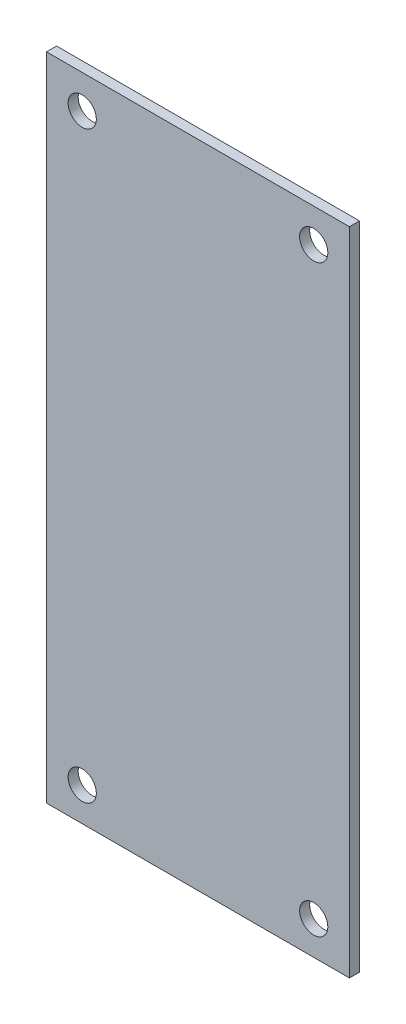
ISO-10303-21;
HEADER;
FILE_DESCRIPTION(('STEP AP214'),'2;1');
FILE_NAME('part.step','',(''),(''),'','','');
FILE_SCHEMA(('AUTOMOTIVE_DESIGN { 1 0 10303 214 1 1 1 1 }'));
ENDSEC;
DATA;
#1=APPLICATION_CONTEXT('core data for automotive mechanical design processes');
#2=APPLICATION_PROTOCOL_DEFINITION('international standard','automotive_design',2000,#1);
#3=PRODUCT_CONTEXT('',#1,'mechanical');
#4=PRODUCT('Part','Part','',(#3));
#5=PRODUCT_RELATED_PRODUCT_CATEGORY('part','',(#4));
#6=PRODUCT_DEFINITION_FORMATION('','',#4);
#7=PRODUCT_DEFINITION_CONTEXT('part definition',#1,'design');
#8=PRODUCT_DEFINITION('design','',#6,#7);
#9=PRODUCT_DEFINITION_SHAPE('','',#8);
#10=(LENGTH_UNIT() NAMED_UNIT(*) SI_UNIT(.MILLI.,.METRE.));
#11=(NAMED_UNIT(*) PLANE_ANGLE_UNIT() SI_UNIT($,.RADIAN.));
#12=(NAMED_UNIT(*) SI_UNIT($,.STERADIAN.) SOLID_ANGLE_UNIT());
#13=UNCERTAINTY_MEASURE_WITH_UNIT(LENGTH_MEASURE(1.E-05),#10,'distance_accuracy_value','');
#14=(GEOMETRIC_REPRESENTATION_CONTEXT(3) GLOBAL_UNCERTAINTY_ASSIGNED_CONTEXT((#13)) GLOBAL_UNIT_ASSIGNED_CONTEXT((#10,
#11,#12)) REPRESENTATION_CONTEXT('',''));
#15=CARTESIAN_POINT('',(0.,0.,0.));
#16=DIRECTION('',(0.,0.,1.));
#17=DIRECTION('',(1.,0.,0.));
#18=AXIS2_PLACEMENT_3D('',#15,#16,#17);
#19=CARTESIAN_POINT('',(0.,0.,1.));
#20=DIRECTION('',(0.,0.,1.));
#21=DIRECTION('',(1.,0.,0.));
#22=AXIS2_PLACEMENT_3D('',#19,#20,#21);
#23=PLANE('',#22);
#24=CARTESIAN_POINT('',(11.5,29.,1.));
#25=DIRECTION('',(0.,0.,1.));
#26=DIRECTION('',(-1.,0.,0.));
#27=AXIS2_PLACEMENT_3D('',#24,#25,#26);
#28=CIRCLE('',#27,1.4);
#29=CARTESIAN_POINT('',(10.1,29.,1.));
#30=VERTEX_POINT('',#29);
#31=EDGE_CURVE('E142',#30,#30,#28,.T.);
#32=ORIENTED_EDGE('',*,*,#31,.F.);
#33=EDGE_LOOP('',(#32));
#34=FACE_BOUND('',#33,.T.);
#35=CARTESIAN_POINT('',(-11.5,-29.,1.));
#36=DIRECTION('',(0.,0.,1.));
#37=DIRECTION('',(1.,0.,0.));
#38=AXIS2_PLACEMENT_3D('',#35,#36,#37);
#39=CIRCLE('',#38,1.4);
#40=CARTESIAN_POINT('',(-10.1,-29.,1.));
#41=VERTEX_POINT('',#40);
#42=EDGE_CURVE('E112',#41,#41,#39,.T.);
#43=ORIENTED_EDGE('',*,*,#42,.F.);
#44=EDGE_LOOP('',(#43));
#45=FACE_BOUND('',#44,.T.);
#46=DIRECTION('',(0.,-1.,0.));
#47=VECTOR('',#46,1.);
#48=CARTESIAN_POINT('',(-15.05,-32.3215,1.));
#49=LINE('',#48,#47);
#50=CARTESIAN_POINT('',(-15.05,32.3215,1.));
#51=VERTEX_POINT('',#50);
#52=CARTESIAN_POINT('',(-15.05,-32.3215,1.));
#53=VERTEX_POINT('',#52);
#54=EDGE_CURVE('E92',#51,#53,#49,.T.);
#55=ORIENTED_EDGE('',*,*,#54,.T.);
#56=DIRECTION('',(1.,0.,0.));
#57=VECTOR('',#56,1.);
#58=CARTESIAN_POINT('',(15.05,-32.3215,1.));
#59=LINE('',#58,#57);
#60=CARTESIAN_POINT('',(15.05,-32.3215,1.));
#61=VERTEX_POINT('',#60);
#62=EDGE_CURVE('E87',#53,#61,#59,.T.);
#63=ORIENTED_EDGE('',*,*,#62,.T.);
#64=DIRECTION('',(0.,1.,0.));
#65=VECTOR('',#64,1.);
#66=CARTESIAN_POINT('',(15.05,-32.3215,1.));
#67=LINE('',#66,#65);
#68=CARTESIAN_POINT('',(15.05,32.3215,1.));
#69=VERTEX_POINT('',#68);
#70=EDGE_CURVE('E90',#61,#69,#67,.T.);
#71=ORIENTED_EDGE('',*,*,#70,.T.);
#72=DIRECTION('',(-1.,0.,0.));
#73=VECTOR('',#72,1.);
#74=CARTESIAN_POINT('',(15.05,32.3215,1.));
#75=LINE('',#74,#73);
#76=EDGE_CURVE('E57',#69,#51,#75,.T.);
#77=ORIENTED_EDGE('',*,*,#76,.T.);
#78=EDGE_LOOP('',(#55,#63,#71,#77));
#79=FACE_BOUND('',#78,.T.);
#80=CARTESIAN_POINT('',(11.5,-29.,1.));
#81=DIRECTION('',(0.,0.,1.));
#82=DIRECTION('',(1.,0.,0.));
#83=AXIS2_PLACEMENT_3D('',#80,#81,#82);
#84=CIRCLE('',#83,1.4);
#85=CARTESIAN_POINT('',(12.9,-29.,1.));
#86=VERTEX_POINT('',#85);
#87=EDGE_CURVE('E134',#86,#86,#84,.T.);
#88=ORIENTED_EDGE('',*,*,#87,.F.);
#89=EDGE_LOOP('',(#88));
#90=FACE_BOUND('',#89,.T.);
#91=CARTESIAN_POINT('',(-11.5,29.,1.));
#92=DIRECTION('',(0.,0.,1.));
#93=DIRECTION('',(-1.,0.,0.));
#94=AXIS2_PLACEMENT_3D('',#91,#92,#93);
#95=CIRCLE('',#94,1.4);
#96=CARTESIAN_POINT('',(-12.9,29.,1.));
#97=VERTEX_POINT('',#96);
#98=EDGE_CURVE('E150',#97,#97,#95,.T.);
#99=ORIENTED_EDGE('',*,*,#98,.F.);
#100=EDGE_LOOP('',(#99));
#101=FACE_BOUND('',#100,.T.);
#102=ADVANCED_FACE('F39',(#34,#45,#79,#90,#101),#23,.T.);
#103=CARTESIAN_POINT('',(0.,0.,0.));
#104=DIRECTION('',(0.,0.,1.));
#105=DIRECTION('',(1.,0.,0.));
#106=AXIS2_PLACEMENT_3D('',#103,#104,#105);
#107=PLANE('',#106);
#108=DIRECTION('',(0.,-1.,0.));
#109=VECTOR('',#108,1.);
#110=CARTESIAN_POINT('',(-15.05,-32.3215,0.));
#111=LINE('',#110,#109);
#112=CARTESIAN_POINT('',(-15.05,32.3215,0.));
#113=VERTEX_POINT('',#112);
#114=CARTESIAN_POINT('',(-15.05,-32.3215,0.));
#115=VERTEX_POINT('',#114);
#116=EDGE_CURVE('E108',#113,#115,#111,.T.);
#117=ORIENTED_EDGE('',*,*,#116,.F.);
#118=DIRECTION('',(-1.,0.,0.));
#119=VECTOR('',#118,1.);
#120=CARTESIAN_POINT('',(15.05,32.3215,0.));
#121=LINE('',#120,#119);
#122=CARTESIAN_POINT('',(15.05,32.3215,0.));
#123=VERTEX_POINT('',#122);
#124=EDGE_CURVE('E80',#123,#113,#121,.T.);
#125=ORIENTED_EDGE('',*,*,#124,.F.);
#126=DIRECTION('',(0.,1.,0.));
#127=VECTOR('',#126,1.);
#128=CARTESIAN_POINT('',(15.05,-32.3215,0.));
#129=LINE('',#128,#127);
#130=CARTESIAN_POINT('',(15.05,-32.3215,0.));
#131=VERTEX_POINT('',#130);
#132=EDGE_CURVE('E74',#131,#123,#129,.T.);
#133=ORIENTED_EDGE('',*,*,#132,.F.);
#134=DIRECTION('',(1.,0.,0.));
#135=VECTOR('',#134,1.);
#136=CARTESIAN_POINT('',(15.05,-32.3215,0.));
#137=LINE('',#136,#135);
#138=EDGE_CURVE('E97',#115,#131,#137,.T.);
#139=ORIENTED_EDGE('',*,*,#138,.F.);
#140=EDGE_LOOP('',(#117,#125,#133,#139));
#141=FACE_BOUND('',#140,.T.);
#142=CARTESIAN_POINT('',(-11.5,-29.,0.));
#143=DIRECTION('',(0.,0.,1.));
#144=DIRECTION('',(1.,0.,0.));
#145=AXIS2_PLACEMENT_3D('',#142,#143,#144);
#146=CIRCLE('',#145,1.4);
#147=CARTESIAN_POINT('',(-10.1,-29.,0.));
#148=VERTEX_POINT('',#147);
#149=EDGE_CURVE('E130',#148,#148,#146,.T.);
#150=ORIENTED_EDGE('',*,*,#149,.T.);
#151=EDGE_LOOP('',(#150));
#152=FACE_BOUND('',#151,.T.);
#153=CARTESIAN_POINT('',(11.5,-29.,0.));
#154=DIRECTION('',(0.,0.,1.));
#155=DIRECTION('',(1.,0.,0.));
#156=AXIS2_PLACEMENT_3D('',#153,#154,#155);
#157=CIRCLE('',#156,1.4);
#158=CARTESIAN_POINT('',(12.9,-29.,0.));
#159=VERTEX_POINT('',#158);
#160=EDGE_CURVE('E138',#159,#159,#157,.T.);
#161=ORIENTED_EDGE('',*,*,#160,.T.);
#162=EDGE_LOOP('',(#161));
#163=FACE_BOUND('',#162,.T.);
#164=CARTESIAN_POINT('',(11.5,29.,0.));
#165=DIRECTION('',(0.,0.,1.));
#166=DIRECTION('',(-1.,0.,0.));
#167=AXIS2_PLACEMENT_3D('',#164,#165,#166);
#168=CIRCLE('',#167,1.4);
#169=CARTESIAN_POINT('',(10.1,29.,0.));
#170=VERTEX_POINT('',#169);
#171=EDGE_CURVE('E146',#170,#170,#168,.T.);
#172=ORIENTED_EDGE('',*,*,#171,.T.);
#173=EDGE_LOOP('',(#172));
#174=FACE_BOUND('',#173,.T.);
#175=CARTESIAN_POINT('',(-11.5,29.,0.));
#176=DIRECTION('',(0.,0.,1.));
#177=DIRECTION('',(-1.,0.,0.));
#178=AXIS2_PLACEMENT_3D('',#175,#176,#177);
#179=CIRCLE('',#178,1.4);
#180=CARTESIAN_POINT('',(-12.9,29.,0.));
#181=VERTEX_POINT('',#180);
#182=EDGE_CURVE('E154',#181,#181,#179,.T.);
#183=ORIENTED_EDGE('',*,*,#182,.T.);
#184=EDGE_LOOP('',(#183));
#185=FACE_BOUND('',#184,.T.);
#186=ADVANCED_FACE('F125',(#141,#152,#163,#174,#185),#107,.F.);
#187=CARTESIAN_POINT('',(-15.05,-32.3215,1.));
#188=DIRECTION('',(1.,0.,0.));
#189=DIRECTION('',(0.,0.,-1.));
#190=AXIS2_PLACEMENT_3D('',#187,#188,#189);
#191=PLANE('',#190);
#192=ORIENTED_EDGE('',*,*,#116,.T.);
#193=DIRECTION('',(0.,0.,-1.));
#194=VECTOR('',#193,1.);
#195=CARTESIAN_POINT('',(-15.05,-32.3215,1.));
#196=LINE('',#195,#194);
#197=EDGE_CURVE('E11',#53,#115,#196,.T.);
#198=ORIENTED_EDGE('',*,*,#197,.F.);
#199=ORIENTED_EDGE('',*,*,#54,.F.);
#200=DIRECTION('',(0.,0.,-1.));
#201=VECTOR('',#200,1.);
#202=CARTESIAN_POINT('',(-15.05,32.3215,1.));
#203=LINE('',#202,#201);
#204=EDGE_CURVE('E104',#51,#113,#203,.T.);
#205=ORIENTED_EDGE('',*,*,#204,.T.);
#206=EDGE_LOOP('',(#192,#198,#199,#205));
#207=FACE_BOUND('',#206,.T.);
#208=ADVANCED_FACE('F41',(#207),#191,.F.);
#209=CARTESIAN_POINT('',(15.05,-32.3215,1.));
#210=DIRECTION('',(0.,1.,0.));
#211=DIRECTION('',(0.,0.,1.));
#212=AXIS2_PLACEMENT_3D('',#209,#210,#211);
#213=PLANE('',#212);
#214=ORIENTED_EDGE('',*,*,#138,.T.);
#215=DIRECTION('',(0.,0.,-1.));
#216=VECTOR('',#215,1.);
#217=CARTESIAN_POINT('',(15.05,-32.3215,1.));
#218=LINE('',#217,#216);
#219=EDGE_CURVE('E49',#61,#131,#218,.T.);
#220=ORIENTED_EDGE('',*,*,#219,.F.);
#221=ORIENTED_EDGE('',*,*,#62,.F.);
#222=ORIENTED_EDGE('',*,*,#197,.T.);
#223=EDGE_LOOP('',(#214,#220,#221,#222));
#224=FACE_BOUND('',#223,.T.);
#225=ADVANCED_FACE('F96',(#224),#213,.F.);
#226=CARTESIAN_POINT('',(15.05,-32.3215,1.));
#227=DIRECTION('',(-1.,0.,0.));
#228=DIRECTION('',(0.,0.,1.));
#229=AXIS2_PLACEMENT_3D('',#226,#227,#228);
#230=PLANE('',#229);
#231=ORIENTED_EDGE('',*,*,#132,.T.);
#232=DIRECTION('',(0.,0.,-1.));
#233=VECTOR('',#232,1.);
#234=CARTESIAN_POINT('',(15.05,32.3215,1.));
#235=LINE('',#234,#233);
#236=EDGE_CURVE('E99',#69,#123,#235,.T.);
#237=ORIENTED_EDGE('',*,*,#236,.F.);
#238=ORIENTED_EDGE('',*,*,#70,.F.);
#239=ORIENTED_EDGE('',*,*,#219,.T.);
#240=EDGE_LOOP('',(#231,#237,#238,#239));
#241=FACE_BOUND('',#240,.T.);
#242=ADVANCED_FACE('F100',(#241),#230,.F.);
#243=CARTESIAN_POINT('',(15.05,32.3215,1.));
#244=DIRECTION('',(0.,-1.,0.));
#245=DIRECTION('',(0.,0.,-1.));
#246=AXIS2_PLACEMENT_3D('',#243,#244,#245);
#247=PLANE('',#246);
#248=ORIENTED_EDGE('',*,*,#124,.T.);
#249=ORIENTED_EDGE('',*,*,#204,.F.);
#250=ORIENTED_EDGE('',*,*,#76,.F.);
#251=ORIENTED_EDGE('',*,*,#236,.T.);
#252=EDGE_LOOP('',(#248,#249,#250,#251));
#253=FACE_BOUND('',#252,.T.);
#254=ADVANCED_FACE('F122',(#253),#247,.F.);
#255=CARTESIAN_POINT('',(-11.5,-29.,1.));
#256=DIRECTION('',(0.,0.,-1.));
#257=DIRECTION('',(-1.,0.,0.));
#258=AXIS2_PLACEMENT_3D('',#255,#256,#257);
#259=CYLINDRICAL_SURFACE('',#258,1.4);
#260=ORIENTED_EDGE('',*,*,#42,.T.);
#261=EDGE_LOOP('',(#260));
#262=FACE_BOUND('',#261,.T.);
#263=ORIENTED_EDGE('',*,*,#149,.F.);
#264=EDGE_LOOP('',(#263));
#265=FACE_BOUND('',#264,.T.);
#266=ADVANCED_FACE('F175',(#262,#265),#259,.F.);
#267=CARTESIAN_POINT('',(11.5,-29.,1.));
#268=DIRECTION('',(0.,0.,-1.));
#269=DIRECTION('',(-1.,0.,0.));
#270=AXIS2_PLACEMENT_3D('',#267,#268,#269);
#271=CYLINDRICAL_SURFACE('',#270,1.4);
#272=ORIENTED_EDGE('',*,*,#87,.T.);
#273=EDGE_LOOP('',(#272));
#274=FACE_BOUND('',#273,.T.);
#275=ORIENTED_EDGE('',*,*,#160,.F.);
#276=EDGE_LOOP('',(#275));
#277=FACE_BOUND('',#276,.T.);
#278=ADVANCED_FACE('F221',(#274,#277),#271,.F.);
#279=CARTESIAN_POINT('',(11.5,29.,1.));
#280=DIRECTION('',(0.,0.,-1.));
#281=DIRECTION('',(-1.,0.,0.));
#282=AXIS2_PLACEMENT_3D('',#279,#280,#281);
#283=CYLINDRICAL_SURFACE('',#282,1.4);
#284=ORIENTED_EDGE('',*,*,#31,.T.);
#285=EDGE_LOOP('',(#284));
#286=FACE_BOUND('',#285,.T.);
#287=ORIENTED_EDGE('',*,*,#171,.F.);
#288=EDGE_LOOP('',(#287));
#289=FACE_BOUND('',#288,.T.);
#290=ADVANCED_FACE('F229',(#286,#289),#283,.F.);
#291=CARTESIAN_POINT('',(-11.5,29.,1.));
#292=DIRECTION('',(0.,0.,-1.));
#293=DIRECTION('',(-1.,0.,0.));
#294=AXIS2_PLACEMENT_3D('',#291,#292,#293);
#295=CYLINDRICAL_SURFACE('',#294,1.4);
#296=ORIENTED_EDGE('',*,*,#98,.T.);
#297=EDGE_LOOP('',(#296));
#298=FACE_BOUND('',#297,.T.);
#299=ORIENTED_EDGE('',*,*,#182,.F.);
#300=EDGE_LOOP('',(#299));
#301=FACE_BOUND('',#300,.T.);
#302=ADVANCED_FACE('F162',(#298,#301),#295,.F.);
#303=CLOSED_SHELL('',(#102,#186,#208,#225,#242,#254,#266,#278,#290,#302));
#304=MANIFOLD_SOLID_BREP('B2',#303);
#305=ADVANCED_BREP_SHAPE_REPRESENTATION('',(#18,#304),#14);
#306=SHAPE_DEFINITION_REPRESENTATION(#9,#305);
ENDSEC;
END-ISO-10303-21;
